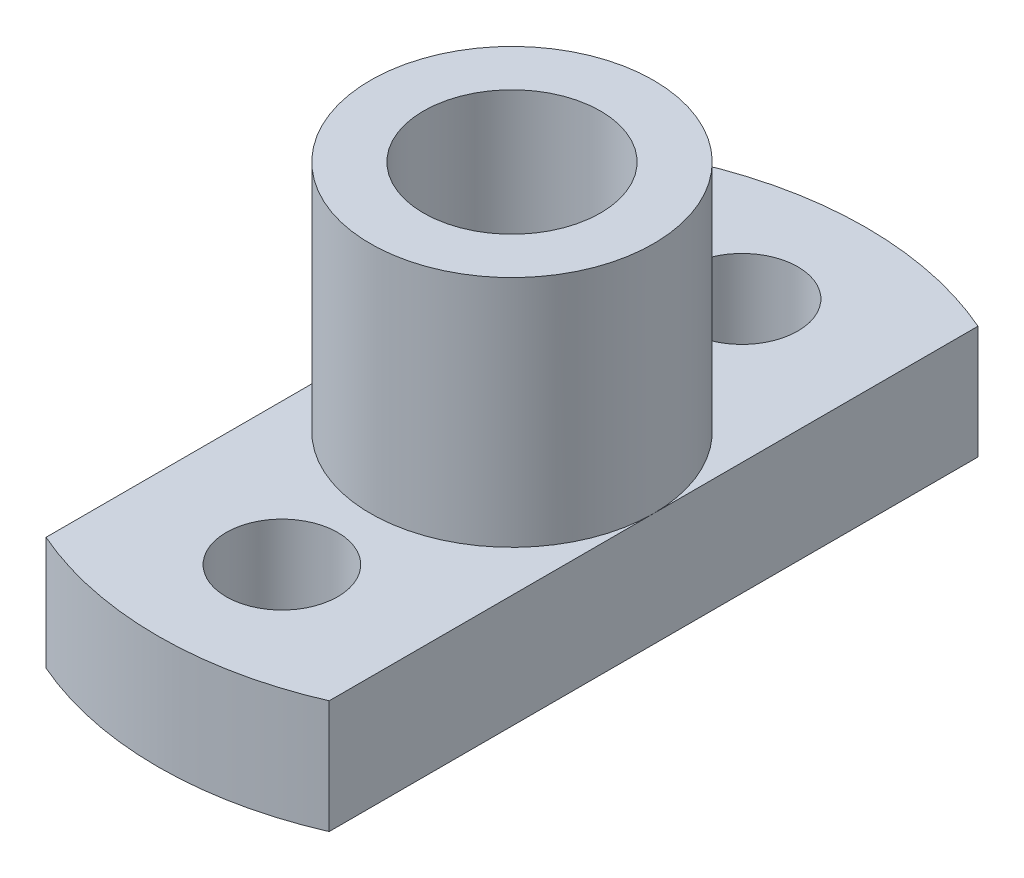
ISO-10303-21;
HEADER;
FILE_DESCRIPTION(('STEP AP214'),'2;1');
FILE_NAME('part.step','',(''),(''),'','','');
FILE_SCHEMA(('AUTOMOTIVE_DESIGN { 1 0 10303 214 1 1 1 1 }'));
ENDSEC;
DATA;
#1=APPLICATION_CONTEXT('core data for automotive mechanical design processes');
#2=APPLICATION_PROTOCOL_DEFINITION('international standard','automotive_design',2000,#1);
#3=PRODUCT_CONTEXT('',#1,'mechanical');
#4=PRODUCT('Part','Part','',(#3));
#5=PRODUCT_RELATED_PRODUCT_CATEGORY('part','',(#4));
#6=PRODUCT_DEFINITION_FORMATION('','',#4);
#7=PRODUCT_DEFINITION_CONTEXT('part definition',#1,'design');
#8=PRODUCT_DEFINITION('design','',#6,#7);
#9=PRODUCT_DEFINITION_SHAPE('','',#8);
#10=(LENGTH_UNIT() NAMED_UNIT(*) SI_UNIT(.MILLI.,.METRE.));
#11=(NAMED_UNIT(*) PLANE_ANGLE_UNIT() SI_UNIT($,.RADIAN.));
#12=(NAMED_UNIT(*) SI_UNIT($,.STERADIAN.) SOLID_ANGLE_UNIT());
#13=UNCERTAINTY_MEASURE_WITH_UNIT(LENGTH_MEASURE(1.E-05),#10,'distance_accuracy_value','');
#14=(GEOMETRIC_REPRESENTATION_CONTEXT(3) GLOBAL_UNCERTAINTY_ASSIGNED_CONTEXT((#13)) GLOBAL_UNIT_ASSIGNED_CONTEXT((#10,
#11,#12)) REPRESENTATION_CONTEXT('',''));
#15=CARTESIAN_POINT('',(0.,0.,0.));
#16=DIRECTION('',(0.,0.,1.));
#17=DIRECTION('',(1.,0.,0.));
#18=AXIS2_PLACEMENT_3D('',#15,#16,#17);
#19=CARTESIAN_POINT('',(2.5,0.,0.));
#20=DIRECTION('',(0.,-1.,0.));
#21=DIRECTION('',(0.,0.,-1.));
#22=AXIS2_PLACEMENT_3D('',#19,#20,#21);
#23=PLANE('',#22);
#24=CARTESIAN_POINT('',(0.,0.,-6.5));
#25=DIRECTION('',(0.,-1.,0.));
#26=DIRECTION('',(0.,0.,-1.));
#27=AXIS2_PLACEMENT_3D('',#24,#25,#26);
#28=CIRCLE('',#27,1.575);
#29=CARTESIAN_POINT('',(0.,0.,-8.075));
#30=VERTEX_POINT('',#29);
#31=EDGE_CURVE('E131',#30,#30,#28,.T.);
#32=ORIENTED_EDGE('',*,*,#31,.F.);
#33=EDGE_LOOP('',(#32));
#34=FACE_BOUND('',#33,.T.);
#35=CARTESIAN_POINT('',(0.,0.,6.5));
#36=DIRECTION('',(0.,-1.,0.));
#37=DIRECTION('',(0.,0.,-1.));
#38=AXIS2_PLACEMENT_3D('',#35,#36,#37);
#39=CIRCLE('',#38,1.575);
#40=CARTESIAN_POINT('',(0.,0.,4.925));
#41=VERTEX_POINT('',#40);
#42=EDGE_CURVE('E120',#41,#41,#39,.T.);
#43=ORIENTED_EDGE('',*,*,#42,.F.);
#44=EDGE_LOOP('',(#43));
#45=FACE_BOUND('',#44,.T.);
#46=CARTESIAN_POINT('',(0.,0.,0.));
#47=DIRECTION('',(0.,-1.,0.));
#48=DIRECTION('',(0.,0.,-1.));
#49=AXIS2_PLACEMENT_3D('',#46,#47,#48);
#50=CIRCLE('',#49,2.5);
#51=CARTESIAN_POINT('',(0.,0.,-2.5));
#52=VERTEX_POINT('',#51);
#53=EDGE_CURVE('E14',#52,#52,#50,.T.);
#54=ORIENTED_EDGE('',*,*,#53,.F.);
#55=EDGE_LOOP('',(#54));
#56=FACE_BOUND('',#55,.T.);
#57=CARTESIAN_POINT('',(0.,0.,0.));
#58=DIRECTION('',(0.,-1.,0.));
#59=DIRECTION('',(0.,0.,-1.));
#60=AXIS2_PLACEMENT_3D('',#57,#58,#59);
#61=CIRCLE('',#60,10.);
#62=CARTESIAN_POINT('',(-4.,0.,-9.16515138991168));
#63=VERTEX_POINT('',#62);
#64=CARTESIAN_POINT('',(4.,0.,-9.16515138991168));
#65=VERTEX_POINT('',#64);
#66=EDGE_CURVE('E54',#63,#65,#61,.T.);
#67=ORIENTED_EDGE('',*,*,#66,.T.);
#68=DIRECTION('',(0.,0.,1.));
#69=VECTOR('',#68,1.);
#70=CARTESIAN_POINT('',(4.,0.,-10.));
#71=LINE('',#70,#69);
#72=CARTESIAN_POINT('',(4.,0.,9.16515138991168));
#73=VERTEX_POINT('',#72);
#74=EDGE_CURVE('E94',#65,#73,#71,.T.);
#75=ORIENTED_EDGE('',*,*,#74,.T.);
#76=CARTESIAN_POINT('',(-4.,0.,9.16515138991168));
#77=VERTEX_POINT('',#76);
#78=EDGE_CURVE('E113',#73,#77,#61,.T.);
#79=ORIENTED_EDGE('',*,*,#78,.T.);
#80=DIRECTION('',(0.,0.,-1.));
#81=VECTOR('',#80,1.);
#82=CARTESIAN_POINT('',(-4.,0.,-10.));
#83=LINE('',#82,#81);
#84=EDGE_CURVE('E100',#77,#63,#83,.T.);
#85=ORIENTED_EDGE('',*,*,#84,.T.);
#86=EDGE_LOOP('',(#67,#75,#79,#85));
#87=FACE_BOUND('',#86,.T.);
#88=ADVANCED_FACE('F45',(#34,#45,#56,#87),#23,.T.);
#89=CARTESIAN_POINT('',(0.,0.,0.));
#90=DIRECTION('',(0.,-1.,0.));
#91=DIRECTION('',(0.,0.,-1.));
#92=AXIS2_PLACEMENT_3D('',#89,#90,#91);
#93=CYLINDRICAL_SURFACE('',#92,10.);
#94=DIRECTION('',(0.,-1.,0.));
#95=VECTOR('',#94,1.);
#96=CARTESIAN_POINT('',(-4.,0.,-9.16515138991168));
#97=LINE('',#96,#95);
#98=CARTESIAN_POINT('',(-4.,3.2,-9.16515138991168));
#99=VERTEX_POINT('',#98);
#100=EDGE_CURVE('E188',#63,#99,#97,.F.);
#101=ORIENTED_EDGE('',*,*,#100,.T.);
#102=CARTESIAN_POINT('',(0.,3.2,0.));
#103=DIRECTION('',(0.,-1.,0.));
#104=DIRECTION('',(0.,0.,-1.));
#105=AXIS2_PLACEMENT_3D('',#102,#103,#104);
#106=CIRCLE('',#105,10.);
#107=CARTESIAN_POINT('',(4.,3.2,-9.16515138991168));
#108=VERTEX_POINT('',#107);
#109=EDGE_CURVE('E107',#99,#108,#106,.T.);
#110=ORIENTED_EDGE('',*,*,#109,.T.);
#111=DIRECTION('',(0.,-1.,0.));
#112=VECTOR('',#111,1.);
#113=CARTESIAN_POINT('',(4.,0.,-9.16515138991168));
#114=LINE('',#113,#112);
#115=EDGE_CURVE('E70',#108,#65,#114,.T.);
#116=ORIENTED_EDGE('',*,*,#115,.T.);
#117=ORIENTED_EDGE('',*,*,#66,.F.);
#118=EDGE_LOOP('',(#101,#110,#116,#117));
#119=FACE_BOUND('',#118,.T.);
#120=ADVANCED_FACE('F105',(#119),#93,.T.);
#121=CARTESIAN_POINT('',(4.,3.2,9.16515138991168));
#122=VERTEX_POINT('',#121);
#123=CARTESIAN_POINT('',(-4.,3.2,9.16515138991168));
#124=VERTEX_POINT('',#123);
#125=EDGE_CURVE('E62',#122,#124,#106,.T.);
#126=ORIENTED_EDGE('',*,*,#125,.T.);
#127=DIRECTION('',(0.,-1.,0.));
#128=VECTOR('',#127,1.);
#129=CARTESIAN_POINT('',(-4.,0.,9.16515138991168));
#130=LINE('',#129,#128);
#131=EDGE_CURVE('E184',#124,#77,#130,.T.);
#132=ORIENTED_EDGE('',*,*,#131,.T.);
#133=ORIENTED_EDGE('',*,*,#78,.F.);
#134=DIRECTION('',(0.,-1.,0.));
#135=VECTOR('',#134,1.);
#136=CARTESIAN_POINT('',(4.,0.,9.16515138991168));
#137=LINE('',#136,#135);
#138=EDGE_CURVE('E96',#73,#122,#137,.F.);
#139=ORIENTED_EDGE('',*,*,#138,.T.);
#140=EDGE_LOOP('',(#126,#132,#133,#139));
#141=FACE_BOUND('',#140,.T.);
#142=ADVANCED_FACE('F170',(#141),#93,.T.);
#143=CARTESIAN_POINT('',(10.,3.2,0.));
#144=DIRECTION('',(0.,1.,0.));
#145=DIRECTION('',(0.,0.,1.));
#146=AXIS2_PLACEMENT_3D('',#143,#144,#145);
#147=PLANE('',#146);
#148=CARTESIAN_POINT('',(0.,3.2,6.5));
#149=DIRECTION('',(0.,1.,0.));
#150=DIRECTION('',(0.,0.,1.));
#151=AXIS2_PLACEMENT_3D('',#148,#149,#150);
#152=CIRCLE('',#151,1.575);
#153=CARTESIAN_POINT('',(0.,3.2,8.075));
#154=VERTEX_POINT('',#153);
#155=EDGE_CURVE('E117',#154,#154,#152,.T.);
#156=ORIENTED_EDGE('',*,*,#155,.F.);
#157=EDGE_LOOP('',(#156));
#158=FACE_BOUND('',#157,.T.);
#159=ORIENTED_EDGE('',*,*,#125,.F.);
#160=DIRECTION('',(0.,0.,-1.));
#161=VECTOR('',#160,1.);
#162=CARTESIAN_POINT('',(4.,3.2,0.));
#163=LINE('',#162,#161);
#164=CARTESIAN_POINT('',(4.,3.2,0.));
#165=VERTEX_POINT('',#164);
#166=EDGE_CURVE('E108',#122,#165,#163,.T.);
#167=ORIENTED_EDGE('',*,*,#166,.T.);
#168=CARTESIAN_POINT('',(0.,3.2,0.));
#169=DIRECTION('',(0.,-1.,0.));
#170=DIRECTION('',(0.,0.,-1.));
#171=AXIS2_PLACEMENT_3D('',#168,#169,#170);
#172=CIRCLE('',#171,4.);
#173=CARTESIAN_POINT('',(-4.,3.2,0.));
#174=VERTEX_POINT('',#173);
#175=EDGE_CURVE('E137',#165,#174,#172,.T.);
#176=ORIENTED_EDGE('',*,*,#175,.T.);
#177=DIRECTION('',(0.,0.,1.));
#178=VECTOR('',#177,1.);
#179=CARTESIAN_POINT('',(-4.,3.2,0.));
#180=LINE('',#179,#178);
#181=EDGE_CURVE('E182',#174,#124,#180,.T.);
#182=ORIENTED_EDGE('',*,*,#181,.T.);
#183=EDGE_LOOP('',(#159,#167,#176,#182));
#184=FACE_BOUND('',#183,.T.);
#185=ADVANCED_FACE('F174',(#158,#184),#147,.T.);
#186=CARTESIAN_POINT('',(0.,3.2,-6.5));
#187=DIRECTION('',(0.,1.,0.));
#188=DIRECTION('',(0.,0.,1.));
#189=AXIS2_PLACEMENT_3D('',#186,#187,#188);
#190=CIRCLE('',#189,1.575);
#191=CARTESIAN_POINT('',(0.,3.2,-4.925));
#192=VERTEX_POINT('',#191);
#193=EDGE_CURVE('E49',#192,#192,#190,.T.);
#194=ORIENTED_EDGE('',*,*,#193,.F.);
#195=EDGE_LOOP('',(#194));
#196=FACE_BOUND('',#195,.T.);
#197=EDGE_CURVE('E136',#174,#165,#172,.T.);
#198=ORIENTED_EDGE('',*,*,#197,.T.);
#199=EDGE_CURVE('E109',#165,#108,#163,.T.);
#200=ORIENTED_EDGE('',*,*,#199,.T.);
#201=ORIENTED_EDGE('',*,*,#109,.F.);
#202=EDGE_CURVE('E149',#99,#174,#180,.T.);
#203=ORIENTED_EDGE('',*,*,#202,.T.);
#204=EDGE_LOOP('',(#198,#200,#201,#203));
#205=FACE_BOUND('',#204,.T.);
#206=ADVANCED_FACE('F147',(#196,#205),#147,.T.);
#207=CARTESIAN_POINT('',(0.,0.,0.));
#208=DIRECTION('',(0.,-1.,0.));
#209=DIRECTION('',(0.,0.,-1.));
#210=AXIS2_PLACEMENT_3D('',#207,#208,#209);
#211=CYLINDRICAL_SURFACE('',#210,2.5);
#212=ORIENTED_EDGE('',*,*,#53,.T.);
#213=EDGE_LOOP('',(#212));
#214=FACE_BOUND('',#213,.T.);
#215=CARTESIAN_POINT('',(0.,9.8,0.));
#216=DIRECTION('',(0.,-1.,0.));
#217=DIRECTION('',(0.,0.,-1.));
#218=AXIS2_PLACEMENT_3D('',#215,#216,#217);
#219=CIRCLE('',#218,2.5);
#220=CARTESIAN_POINT('',(0.,9.8,-2.5));
#221=VERTEX_POINT('',#220);
#222=EDGE_CURVE('E119',#221,#221,#219,.T.);
#223=ORIENTED_EDGE('',*,*,#222,.F.);
#224=EDGE_LOOP('',(#223));
#225=FACE_BOUND('',#224,.T.);
#226=ADVANCED_FACE('F47',(#214,#225),#211,.F.);
#227=CARTESIAN_POINT('',(0.,0.,0.));
#228=DIRECTION('',(0.,-1.,0.));
#229=DIRECTION('',(0.,0.,-1.));
#230=AXIS2_PLACEMENT_3D('',#227,#228,#229);
#231=CYLINDRICAL_SURFACE('',#230,4.);
#232=CARTESIAN_POINT('',(0.,9.8,0.));
#233=DIRECTION('',(0.,-1.,0.));
#234=DIRECTION('',(0.,0.,-1.));
#235=AXIS2_PLACEMENT_3D('',#232,#233,#234);
#236=CIRCLE('',#235,4.);
#237=CARTESIAN_POINT('',(0.,9.8,-4.));
#238=VERTEX_POINT('',#237);
#239=EDGE_CURVE('E124',#238,#238,#236,.T.);
#240=ORIENTED_EDGE('',*,*,#239,.T.);
#241=EDGE_LOOP('',(#240));
#242=FACE_BOUND('',#241,.T.);
#243=ORIENTED_EDGE('',*,*,#175,.F.);
#244=ORIENTED_EDGE('',*,*,#197,.F.);
#245=EDGE_LOOP('',(#243,#244));
#246=FACE_BOUND('',#245,.T.);
#247=ADVANCED_FACE('F151',(#242,#246),#231,.T.);
#248=CARTESIAN_POINT('',(4.,9.8,0.));
#249=DIRECTION('',(0.,1.,0.));
#250=DIRECTION('',(0.,0.,1.));
#251=AXIS2_PLACEMENT_3D('',#248,#249,#250);
#252=PLANE('',#251);
#253=ORIENTED_EDGE('',*,*,#222,.T.);
#254=EDGE_LOOP('',(#253));
#255=FACE_BOUND('',#254,.T.);
#256=ORIENTED_EDGE('',*,*,#239,.F.);
#257=EDGE_LOOP('',(#256));
#258=FACE_BOUND('',#257,.T.);
#259=ADVANCED_FACE('F153',(#255,#258),#252,.T.);
#260=CARTESIAN_POINT('',(0.,9.8,6.5));
#261=DIRECTION('',(0.,-1.,0.));
#262=DIRECTION('',(0.,0.,-1.));
#263=AXIS2_PLACEMENT_3D('',#260,#261,#262);
#264=CYLINDRICAL_SURFACE('',#263,1.575);
#265=ORIENTED_EDGE('',*,*,#155,.T.);
#266=EDGE_LOOP('',(#265));
#267=FACE_BOUND('',#266,.T.);
#268=ORIENTED_EDGE('',*,*,#42,.T.);
#269=EDGE_LOOP('',(#268));
#270=FACE_BOUND('',#269,.T.);
#271=ADVANCED_FACE('F160',(#267,#270),#264,.F.);
#272=CARTESIAN_POINT('',(0.,9.8,-6.5));
#273=DIRECTION('',(0.,-1.,0.));
#274=DIRECTION('',(0.,0.,-1.));
#275=AXIS2_PLACEMENT_3D('',#272,#273,#274);
#276=CYLINDRICAL_SURFACE('',#275,1.575);
#277=ORIENTED_EDGE('',*,*,#193,.T.);
#278=EDGE_LOOP('',(#277));
#279=FACE_BOUND('',#278,.T.);
#280=ORIENTED_EDGE('',*,*,#31,.T.);
#281=EDGE_LOOP('',(#280));
#282=FACE_BOUND('',#281,.T.);
#283=ADVANCED_FACE('F193',(#279,#282),#276,.F.);
#284=CARTESIAN_POINT('',(-4.,9.8,-10.));
#285=DIRECTION('',(-1.,0.,0.));
#286=DIRECTION('',(0.,0.,1.));
#287=AXIS2_PLACEMENT_3D('',#284,#285,#286);
#288=PLANE('',#287);
#289=ORIENTED_EDGE('',*,*,#84,.F.);
#290=ORIENTED_EDGE('',*,*,#131,.F.);
#291=ORIENTED_EDGE('',*,*,#181,.F.);
#292=ORIENTED_EDGE('',*,*,#202,.F.);
#293=ORIENTED_EDGE('',*,*,#100,.F.);
#294=EDGE_LOOP('',(#289,#290,#291,#292,#293));
#295=FACE_BOUND('',#294,.T.);
#296=ADVANCED_FACE('F195',(#295),#288,.T.);
#297=CARTESIAN_POINT('',(4.,9.8,-10.));
#298=DIRECTION('',(1.,0.,0.));
#299=DIRECTION('',(0.,0.,-1.));
#300=AXIS2_PLACEMENT_3D('',#297,#298,#299);
#301=PLANE('',#300);
#302=ORIENTED_EDGE('',*,*,#74,.F.);
#303=ORIENTED_EDGE('',*,*,#115,.F.);
#304=ORIENTED_EDGE('',*,*,#199,.F.);
#305=ORIENTED_EDGE('',*,*,#166,.F.);
#306=ORIENTED_EDGE('',*,*,#138,.F.);
#307=EDGE_LOOP('',(#302,#303,#304,#305,#306));
#308=FACE_BOUND('',#307,.T.);
#309=ADVANCED_FACE('F95',(#308),#301,.T.);
#310=CLOSED_SHELL('',(#88,#120,#142,#185,#206,#226,#247,#259,#271,#283,#296,#309));
#311=MANIFOLD_SOLID_BREP('B2',#310);
#312=ADVANCED_BREP_SHAPE_REPRESENTATION('',(#18,#311),#14);
#313=SHAPE_DEFINITION_REPRESENTATION(#9,#312);
ENDSEC;
END-ISO-10303-21;
